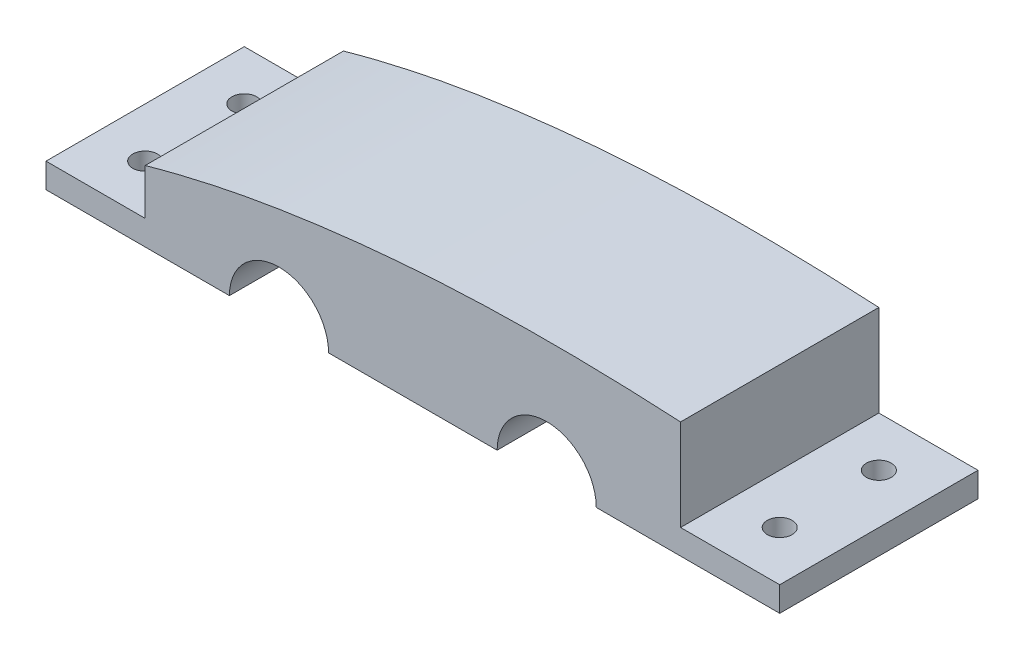
ISO-10303-21;
HEADER;
FILE_DESCRIPTION(('STEP AP214'),'2;1');
FILE_NAME('part.step','',(''),(''),'','','');
FILE_SCHEMA(('AUTOMOTIVE_DESIGN { 1 0 10303 214 1 1 1 1 }'));
ENDSEC;
DATA;
#1=APPLICATION_CONTEXT('core data for automotive mechanical design processes');
#2=APPLICATION_PROTOCOL_DEFINITION('international standard','automotive_design',2000,#1);
#3=PRODUCT_CONTEXT('',#1,'mechanical');
#4=PRODUCT('Part','Part','',(#3));
#5=PRODUCT_RELATED_PRODUCT_CATEGORY('part','',(#4));
#6=PRODUCT_DEFINITION_FORMATION('','',#4);
#7=PRODUCT_DEFINITION_CONTEXT('part definition',#1,'design');
#8=PRODUCT_DEFINITION('design','',#6,#7);
#9=PRODUCT_DEFINITION_SHAPE('','',#8);
#10=(LENGTH_UNIT() NAMED_UNIT(*) SI_UNIT(.MILLI.,.METRE.));
#11=(NAMED_UNIT(*) PLANE_ANGLE_UNIT() SI_UNIT($,.RADIAN.));
#12=(NAMED_UNIT(*) SI_UNIT($,.STERADIAN.) SOLID_ANGLE_UNIT());
#13=UNCERTAINTY_MEASURE_WITH_UNIT(LENGTH_MEASURE(1.E-05),#10,'distance_accuracy_value','');
#14=(GEOMETRIC_REPRESENTATION_CONTEXT(3) GLOBAL_UNCERTAINTY_ASSIGNED_CONTEXT((#13)) GLOBAL_UNIT_ASSIGNED_CONTEXT((#10,
#11,#12)) REPRESENTATION_CONTEXT('',''));
#15=CARTESIAN_POINT('',(0.,0.,0.));
#16=DIRECTION('',(0.,0.,1.));
#17=DIRECTION('',(1.,0.,0.));
#18=AXIS2_PLACEMENT_3D('',#15,#16,#17);
#19=CARTESIAN_POINT('',(171.449749333207,-10.5133996749356,-0.01));
#20=CARTESIAN_POINT('',(167.669323974137,-9.38687144257322,-0.01));
#21=CARTESIAN_POINT('',(160.126717088744,-7.13925145409268,-0.01));
#22=CARTESIAN_POINT('',(145.007574659483,-3.01904156990206,-0.01));
#23=CARTESIAN_POINT('',(126.087520845139,1.58608689730649,-0.01));
#24=CARTESIAN_POINT('',(103.308814692679,6.22402941138375,-0.01));
#25=CARTESIAN_POINT('',(80.5302542305183,10.1235861436547,-0.01));
#26=CARTESIAN_POINT('',(57.7160336117001,13.0616376425244,-0.01));
#27=CARTESIAN_POINT('',(34.8823437261635,15.0991545350443,-0.01));
#28=CARTESIAN_POINT('',(15.7911698545236,15.5692729828805,-0.01));
#29=CARTESIAN_POINT('',(0.522525144892088,14.8779876296715,-0.01));
#30=CARTESIAN_POINT('',(-10.9586608851714,13.7617455830081,-0.01));
#31=CARTESIAN_POINT('',(-22.4803057465122,11.9866767737392,-0.01));
#32=CARTESIAN_POINT('',(-32.0461457755705,9.74964394732173,-0.01));
#33=CARTESIAN_POINT('',(-39.7240058591971,7.44306576154118,-0.01));
#34=CARTESIAN_POINT('',(-45.5245586657192,5.23104505234823,-0.01));
#35=CARTESIAN_POINT('',(-50.4866830328745,2.80755642479047,-0.01));
#36=CARTESIAN_POINT('',(-54.8136805675138,-0.129701936584833,-0.01));
#37=CARTESIAN_POINT('',(-58.6337943880075,-4.92855886518599,-0.01));
#38=CARTESIAN_POINT('',(-54.7252887696433,-8.76141227245682,-0.01));
#39=CARTESIAN_POINT('',(-50.6811146110114,-10.325771279964,-0.01));
#40=CARTESIAN_POINT('',(-45.846738948145,-11.431808673902,-0.01));
#41=CARTESIAN_POINT('',(-40.1214795988188,-12.0720220030842,-0.01));
#42=CARTESIAN_POINT('',(-32.5028216601,-12.6101236186635,-0.01));
#43=CARTESIAN_POINT('',(-22.9740316769994,-12.8105276844888,-0.01));
#44=CARTESIAN_POINT('',(-11.5367123476593,-12.7631001336634,-0.01));
#45=CARTESIAN_POINT('',(-0.100565996580452,-12.4263225613083,-0.01));
#46=CARTESIAN_POINT('',(15.152639595194,-12.076873312515,-0.01));
#47=CARTESIAN_POINT('',(34.2164592156951,-11.6162769088298,-0.01));
#48=CARTESIAN_POINT('',(57.0954752798252,-11.3024167244446,-0.01));
#49=CARTESIAN_POINT('',(79.969407806855,-10.8935719975431,-0.01));
#50=CARTESIAN_POINT('',(102.842157731132,-10.6261384263908,-0.01));
#51=CARTESIAN_POINT('',(125.711620086274,-10.5735026616467,-0.01));
#52=CARTESIAN_POINT('',(144.765723839068,-10.7241641660872,-0.01));
#53=CARTESIAN_POINT('',(160.006871074314,-10.8875679238284,-0.01));
#54=CARTESIAN_POINT('',(167.626083605199,-11.0342639611544,-0.01));
#55=CARTESIAN_POINT('',(171.43558702053,-11.1076099995992,-0.01));
#56=B_SPLINE_CURVE_WITH_KNOTS('',3,(#19,#20,#21,#22,#23,#24,#25,#26,#27,#28,#29,#30,#31,#32,#33,
#34,#35,#36,#37,#38,#39,#40,#41,#42,#43,#44,#45,#46,#47,#48,#49,#50,#51,#52,#53,#54,#55),
.UNSPECIFIED.,.F.,.F.,(4,1,1,1,1,1,1,1,1,1,1,1,1,1,1,1,1,1,1,1,1,1,1,1,1,1,1,1,1,1,1,1,1,1,4),
(0.,0.0253048857109567,0.0504876533905406,0.100520432651506,0.150190715723339,0.199586606894546,
0.248740009224029,0.297715538989186,0.346600594361287,0.371102737044853,0.395726297170324,
0.420570145356384,0.445825119255769,0.458702215791061,0.471919981785349,0.485786002851729,
0.493461050828321,0.506863029175843,0.516147770049506,0.522766002591757,0.535269014058866,
0.54755113395783,0.559786370715184,0.584228898401235,0.608680810066395,0.633151283581104,
0.657621757095812,0.706558114036031,0.755481870433228,0.804405626830425,0.853320223819576,
0.902221408341012,0.951113135961066,0.975557227893806,1.),.UNSPECIFIED.);
#57=DIRECTION('',(0.,0.,1.));
#58=VECTOR('',#57,1.);
#59=SURFACE_OF_LINEAR_EXTRUSION('',#56,#58);
#60=CARTESIAN_POINT('',(171.449749333207,-10.5133996749356,25.4));
#61=CARTESIAN_POINT('',(167.669323974137,-9.38687144257322,25.4));
#62=CARTESIAN_POINT('',(160.126717088744,-7.13925145409268,25.4));
#63=CARTESIAN_POINT('',(145.007574659483,-3.01904156990206,25.4));
#64=CARTESIAN_POINT('',(126.087520845139,1.58608689730649,25.4));
#65=CARTESIAN_POINT('',(103.308814692679,6.22402941138375,25.4));
#66=CARTESIAN_POINT('',(80.5302542305183,10.1235861436547,25.4));
#67=CARTESIAN_POINT('',(57.7160336117001,13.0616376425244,25.4));
#68=CARTESIAN_POINT('',(34.8823437261635,15.0991545350443,25.4));
#69=CARTESIAN_POINT('',(15.7911698545236,15.5692729828805,25.4));
#70=CARTESIAN_POINT('',(0.522525144892088,14.8779876296715,25.4));
#71=CARTESIAN_POINT('',(-10.9586608851714,13.7617455830081,25.4));
#72=CARTESIAN_POINT('',(-22.4803057465122,11.9866767737392,25.4));
#73=CARTESIAN_POINT('',(-32.0461457755705,9.74964394732173,25.4));
#74=CARTESIAN_POINT('',(-39.7240058591971,7.44306576154118,25.4));
#75=CARTESIAN_POINT('',(-45.5245586657192,5.23104505234823,25.4));
#76=CARTESIAN_POINT('',(-50.4866830328745,2.80755642479047,25.4));
#77=CARTESIAN_POINT('',(-54.8136805675138,-0.129701936584833,25.4));
#78=CARTESIAN_POINT('',(-58.6337943880075,-4.92855886518599,25.4));
#79=CARTESIAN_POINT('',(-54.7252887696433,-8.76141227245682,25.4));
#80=CARTESIAN_POINT('',(-50.6811146110114,-10.325771279964,25.4));
#81=CARTESIAN_POINT('',(-45.846738948145,-11.431808673902,25.4));
#82=CARTESIAN_POINT('',(-40.1214795988188,-12.0720220030842,25.4));
#83=CARTESIAN_POINT('',(-32.5028216601,-12.6101236186635,25.4));
#84=CARTESIAN_POINT('',(-22.9740316769994,-12.8105276844888,25.4));
#85=CARTESIAN_POINT('',(-11.5367123476593,-12.7631001336634,25.4));
#86=CARTESIAN_POINT('',(-0.100565996580452,-12.4263225613083,25.4));
#87=CARTESIAN_POINT('',(15.152639595194,-12.076873312515,25.4));
#88=CARTESIAN_POINT('',(34.2164592156951,-11.6162769088298,25.4));
#89=CARTESIAN_POINT('',(57.0954752798252,-11.3024167244446,25.4));
#90=CARTESIAN_POINT('',(79.969407806855,-10.8935719975431,25.4));
#91=CARTESIAN_POINT('',(102.842157731132,-10.6261384263908,25.4));
#92=CARTESIAN_POINT('',(125.711620086274,-10.5735026616467,25.4));
#93=CARTESIAN_POINT('',(144.765723839068,-10.7241641660872,25.4));
#94=CARTESIAN_POINT('',(160.006871074314,-10.8875679238284,25.4));
#95=CARTESIAN_POINT('',(167.626083605199,-11.0342639611544,25.4));
#96=CARTESIAN_POINT('',(171.43558702053,-11.1076099995992,25.4));
#97=B_SPLINE_CURVE_WITH_KNOTS('',3,(#60,#61,#62,#63,#64,#65,#66,#67,#68,#69,#70,#71,#72,#73,#74,
#75,#76,#77,#78,#79,#80,#81,#82,#83,#84,#85,#86,#87,#88,#89,#90,#91,#92,#93,#94,#95,#96),
.UNSPECIFIED.,.F.,.F.,(4,1,1,1,1,1,1,1,1,1,1,1,1,1,1,1,1,1,1,1,1,1,1,1,1,1,1,1,1,1,1,1,1,1,4),
(0.,0.0253048857109567,0.0504876533905406,0.100520432651506,0.150190715723339,0.199586606894546,
0.248740009224029,0.297715538989186,0.346600594361287,0.371102737044853,0.395726297170324,
0.420570145356384,0.445825119255769,0.458702215791061,0.471919981785349,0.485786002851729,
0.493461050828321,0.506863029175843,0.516147770049506,0.522766002591757,0.535269014058866,
0.54755113395783,0.559786370715184,0.584228898401235,0.608680810066395,0.633151283581104,
0.657621757095812,0.706558114036031,0.755481870433228,0.804405626830425,0.853320223819576,
0.902221408341012,0.951113135961066,0.975557227893806,1.),.UNSPECIFIED.);
#98=CARTESIAN_POINT('',(-34.29,9.0400991928682,25.4));
#99=VERTEX_POINT('',#98);
#100=CARTESIAN_POINT('',(34.29,14.886313469361,25.4));
#101=VERTEX_POINT('',#100);
#102=EDGE_CURVE('E219',#99,#101,#97,.F.);
#103=ORIENTED_EDGE('',*,*,#102,.T.);
#104=DIRECTION('',(0.,0.,1.));
#105=VECTOR('',#104,1.);
#106=CARTESIAN_POINT('',(34.29,14.8863134683582,-0.01));
#107=LINE('',#106,#105);
#108=CARTESIAN_POINT('',(34.29,14.886313469361,0.));
#109=VERTEX_POINT('',#108);
#110=EDGE_CURVE('E210',#101,#109,#107,.F.);
#111=ORIENTED_EDGE('',*,*,#110,.T.);
#112=CARTESIAN_POINT('',(171.449749333207,-10.5133996749356,0.));
#113=CARTESIAN_POINT('',(167.669323974137,-9.38687144257322,0.));
#114=CARTESIAN_POINT('',(160.126717088744,-7.13925145409268,0.));
#115=CARTESIAN_POINT('',(145.007574659483,-3.01904156990206,0.));
#116=CARTESIAN_POINT('',(126.087520845139,1.58608689730649,0.));
#117=CARTESIAN_POINT('',(103.308814692679,6.22402941138375,0.));
#118=CARTESIAN_POINT('',(80.5302542305183,10.1235861436547,0.));
#119=CARTESIAN_POINT('',(57.7160336117001,13.0616376425244,0.));
#120=CARTESIAN_POINT('',(34.8823437261635,15.0991545350443,0.));
#121=CARTESIAN_POINT('',(15.7911698545236,15.5692729828805,0.));
#122=CARTESIAN_POINT('',(0.522525144892088,14.8779876296715,0.));
#123=CARTESIAN_POINT('',(-10.9586608851714,13.7617455830081,0.));
#124=CARTESIAN_POINT('',(-22.4803057465122,11.9866767737392,0.));
#125=CARTESIAN_POINT('',(-32.0461457755705,9.74964394732173,0.));
#126=CARTESIAN_POINT('',(-39.7240058591971,7.44306576154118,0.));
#127=CARTESIAN_POINT('',(-45.5245586657192,5.23104505234823,0.));
#128=CARTESIAN_POINT('',(-50.4866830328745,2.80755642479047,0.));
#129=CARTESIAN_POINT('',(-54.8136805675138,-0.129701936584833,0.));
#130=CARTESIAN_POINT('',(-58.6337943880075,-4.92855886518599,0.));
#131=CARTESIAN_POINT('',(-54.7252887696433,-8.76141227245682,0.));
#132=CARTESIAN_POINT('',(-50.6811146110114,-10.325771279964,0.));
#133=CARTESIAN_POINT('',(-45.846738948145,-11.431808673902,0.));
#134=CARTESIAN_POINT('',(-40.1214795988188,-12.0720220030842,0.));
#135=CARTESIAN_POINT('',(-32.5028216601,-12.6101236186635,0.));
#136=CARTESIAN_POINT('',(-22.9740316769994,-12.8105276844888,0.));
#137=CARTESIAN_POINT('',(-11.5367123476593,-12.7631001336634,0.));
#138=CARTESIAN_POINT('',(-0.100565996580452,-12.4263225613083,0.));
#139=CARTESIAN_POINT('',(15.152639595194,-12.076873312515,0.));
#140=CARTESIAN_POINT('',(34.2164592156951,-11.6162769088298,0.));
#141=CARTESIAN_POINT('',(57.0954752798252,-11.3024167244446,0.));
#142=CARTESIAN_POINT('',(79.969407806855,-10.8935719975431,0.));
#143=CARTESIAN_POINT('',(102.842157731132,-10.6261384263908,0.));
#144=CARTESIAN_POINT('',(125.711620086274,-10.5735026616467,0.));
#145=CARTESIAN_POINT('',(144.765723839068,-10.7241641660872,0.));
#146=CARTESIAN_POINT('',(160.006871074314,-10.8875679238284,0.));
#147=CARTESIAN_POINT('',(167.626083605199,-11.0342639611544,0.));
#148=CARTESIAN_POINT('',(171.43558702053,-11.1076099995992,0.));
#149=B_SPLINE_CURVE_WITH_KNOTS('',3,(#112,#113,#114,#115,#116,#117,#118,#119,#120,#121,#122,
#123,#124,#125,#126,#127,#128,#129,#130,#131,#132,#133,#134,#135,#136,#137,#138,#139,#140,#141,
#142,#143,#144,#145,#146,#147,#148),.UNSPECIFIED.,.F.,.F.,(4,1,1,1,1,1,1,1,1,1,1,1,1,1,1,1,1,1,
1,1,1,1,1,1,1,1,1,1,1,1,1,1,1,1,4),(0.,0.0253048857109567,0.0504876533905406,0.100520432651506,
0.150190715723339,0.199586606894546,0.248740009224029,0.297715538989186,0.346600594361287,
0.371102737044853,0.395726297170324,0.420570145356384,0.445825119255769,0.458702215791061,
0.471919981785349,0.485786002851729,0.493461050828321,0.506863029175843,0.516147770049506,
0.522766002591757,0.535269014058866,0.54755113395783,0.559786370715184,0.584228898401235,
0.608680810066395,0.633151283581104,0.657621757095812,0.706558114036031,0.755481870433228,
0.804405626830425,0.853320223819576,0.902221408341012,0.951113135961066,0.975557227893806,1.),.UNSPECIFIED.);
#150=CARTESIAN_POINT('',(-34.29,9.0400991928682,0.));
#151=VERTEX_POINT('',#150);
#152=EDGE_CURVE('E205',#151,#109,#149,.F.);
#153=ORIENTED_EDGE('',*,*,#152,.F.);
#154=DIRECTION('',(0.,0.,1.));
#155=VECTOR('',#154,1.);
#156=CARTESIAN_POINT('',(-34.29,9.0400991930606,-0.01));
#157=LINE('',#156,#155);
#158=EDGE_CURVE('E216',#151,#99,#157,.T.);
#159=ORIENTED_EDGE('',*,*,#158,.T.);
#160=EDGE_LOOP('',(#103,#111,#153,#159));
#161=FACE_BOUND('',#160,.T.);
#162=ADVANCED_FACE('F41',(#161),#59,.T.);
#163=CARTESIAN_POINT('',(40.64,0.,6.34999999999999));
#164=DIRECTION('',(0.,1.,0.));
#165=DIRECTION('',(-1.,0.,0.));
#166=AXIS2_PLACEMENT_3D('',#163,#164,#165);
#167=CYLINDRICAL_SURFACE('',#166,1.5875);
#168=CARTESIAN_POINT('',(40.64,0.,6.34999999999999));
#169=DIRECTION('',(0.,1.,0.));
#170=DIRECTION('',(-1.,0.,0.));
#171=AXIS2_PLACEMENT_3D('',#168,#169,#170);
#172=CIRCLE('',#171,1.5875);
#173=CARTESIAN_POINT('',(39.0525,0.,6.34999999999999));
#174=VERTEX_POINT('',#173);
#175=EDGE_CURVE('E166',#174,#174,#172,.T.);
#176=ORIENTED_EDGE('',*,*,#175,.F.);
#177=EDGE_LOOP('',(#176));
#178=FACE_BOUND('',#177,.T.);
#179=CARTESIAN_POINT('',(40.64,3.175,6.34999999999999));
#180=DIRECTION('',(0.,1.,0.));
#181=DIRECTION('',(-1.,0.,0.));
#182=AXIS2_PLACEMENT_3D('',#179,#180,#181);
#183=CIRCLE('',#182,1.5875);
#184=CARTESIAN_POINT('',(39.0525,3.175,6.34999999999999));
#185=VERTEX_POINT('',#184);
#186=EDGE_CURVE('E186',#185,#185,#183,.T.);
#187=ORIENTED_EDGE('',*,*,#186,.T.);
#188=EDGE_LOOP('',(#187));
#189=FACE_BOUND('',#188,.T.);
#190=ADVANCED_FACE('F313',(#178,#189),#167,.F.);
#191=CARTESIAN_POINT('',(40.64,0.,19.05));
#192=DIRECTION('',(0.,1.,0.));
#193=DIRECTION('',(-1.,0.,0.));
#194=AXIS2_PLACEMENT_3D('',#191,#192,#193);
#195=CYLINDRICAL_SURFACE('',#194,1.5875);
#196=CARTESIAN_POINT('',(40.64,0.,19.05));
#197=DIRECTION('',(0.,1.,0.));
#198=DIRECTION('',(1.,0.,0.));
#199=AXIS2_PLACEMENT_3D('',#196,#197,#198);
#200=CIRCLE('',#199,1.5875);
#201=CARTESIAN_POINT('',(42.2275,0.,19.05));
#202=VERTEX_POINT('',#201);
#203=EDGE_CURVE('E198',#202,#202,#200,.T.);
#204=ORIENTED_EDGE('',*,*,#203,.F.);
#205=EDGE_LOOP('',(#204));
#206=FACE_BOUND('',#205,.T.);
#207=CARTESIAN_POINT('',(40.64,3.175,19.05));
#208=DIRECTION('',(0.,1.,0.));
#209=DIRECTION('',(1.,0.,0.));
#210=AXIS2_PLACEMENT_3D('',#207,#208,#209);
#211=CIRCLE('',#210,1.5875);
#212=CARTESIAN_POINT('',(42.2275,3.175,19.05));
#213=VERTEX_POINT('',#212);
#214=EDGE_CURVE('E189',#213,#213,#211,.T.);
#215=ORIENTED_EDGE('',*,*,#214,.T.);
#216=EDGE_LOOP('',(#215));
#217=FACE_BOUND('',#216,.T.);
#218=ADVANCED_FACE('F315',(#206,#217),#195,.F.);
#219=CARTESIAN_POINT('',(-40.64,0.,19.05));
#220=DIRECTION('',(0.,1.,0.));
#221=DIRECTION('',(-1.,0.,0.));
#222=AXIS2_PLACEMENT_3D('',#219,#220,#221);
#223=CYLINDRICAL_SURFACE('',#222,1.58750000000001);
#224=CARTESIAN_POINT('',(-40.64,0.,19.05));
#225=DIRECTION('',(0.,1.,0.));
#226=DIRECTION('',(-1.,0.,0.));
#227=AXIS2_PLACEMENT_3D('',#224,#225,#226);
#228=CIRCLE('',#227,1.58750000000001);
#229=CARTESIAN_POINT('',(-42.2275,0.,19.05));
#230=VERTEX_POINT('',#229);
#231=EDGE_CURVE('E11',#230,#230,#228,.T.);
#232=ORIENTED_EDGE('',*,*,#231,.F.);
#233=EDGE_LOOP('',(#232));
#234=FACE_BOUND('',#233,.T.);
#235=CARTESIAN_POINT('',(-40.64,3.17499999999992,19.05));
#236=DIRECTION('',(0.,1.,0.));
#237=DIRECTION('',(-1.,0.,0.));
#238=AXIS2_PLACEMENT_3D('',#235,#236,#237);
#239=CIRCLE('',#238,1.58750000000001);
#240=CARTESIAN_POINT('',(-42.2275,3.17499999999992,19.05));
#241=VERTEX_POINT('',#240);
#242=EDGE_CURVE('E53',#241,#241,#239,.T.);
#243=ORIENTED_EDGE('',*,*,#242,.T.);
#244=EDGE_LOOP('',(#243));
#245=FACE_BOUND('',#244,.T.);
#246=ADVANCED_FACE('F307',(#234,#245),#223,.F.);
#247=CARTESIAN_POINT('',(-40.64,0.,6.35));
#248=DIRECTION('',(0.,1.,0.));
#249=DIRECTION('',(-1.,0.,0.));
#250=AXIS2_PLACEMENT_3D('',#247,#248,#249);
#251=CYLINDRICAL_SURFACE('',#250,1.58750000000001);
#252=CARTESIAN_POINT('',(-40.64,0.,6.35));
#253=DIRECTION('',(0.,1.,0.));
#254=DIRECTION('',(1.,0.,0.));
#255=AXIS2_PLACEMENT_3D('',#252,#253,#254);
#256=CIRCLE('',#255,1.58750000000001);
#257=CARTESIAN_POINT('',(-39.0525,0.,6.35));
#258=VERTEX_POINT('',#257);
#259=EDGE_CURVE('E192',#258,#258,#256,.T.);
#260=ORIENTED_EDGE('',*,*,#259,.F.);
#261=EDGE_LOOP('',(#260));
#262=FACE_BOUND('',#261,.T.);
#263=CARTESIAN_POINT('',(-40.64,3.17499999999992,6.35));
#264=DIRECTION('',(0.,1.,0.));
#265=DIRECTION('',(1.,0.,0.));
#266=AXIS2_PLACEMENT_3D('',#263,#264,#265);
#267=CIRCLE('',#266,1.58750000000001);
#268=CARTESIAN_POINT('',(-39.0525,3.17499999999992,6.35));
#269=VERTEX_POINT('',#268);
#270=EDGE_CURVE('E195',#269,#269,#267,.T.);
#271=ORIENTED_EDGE('',*,*,#270,.T.);
#272=EDGE_LOOP('',(#271));
#273=FACE_BOUND('',#272,.T.);
#274=ADVANCED_FACE('F299',(#262,#273),#251,.F.);
#275=CARTESIAN_POINT('',(-46.99,3.17499999999999,25.4));
#276=DIRECTION('',(0.,-1.,0.));
#277=DIRECTION('',(1.,0.,0.));
#278=AXIS2_PLACEMENT_3D('',#275,#276,#277);
#279=PLANE('',#278);
#280=ORIENTED_EDGE('',*,*,#270,.F.);
#281=EDGE_LOOP('',(#280));
#282=FACE_BOUND('',#281,.T.);
#283=ORIENTED_EDGE('',*,*,#242,.F.);
#284=EDGE_LOOP('',(#283));
#285=FACE_BOUND('',#284,.T.);
#286=DIRECTION('',(-1.,0.,0.));
#287=VECTOR('',#286,1.);
#288=CARTESIAN_POINT('',(-46.99,3.17499999999999,0.));
#289=LINE('',#288,#287);
#290=CARTESIAN_POINT('',(-34.29,3.17499999999999,0.));
#291=VERTEX_POINT('',#290);
#292=CARTESIAN_POINT('',(-46.99,3.17499999999999,0.));
#293=VERTEX_POINT('',#292);
#294=EDGE_CURVE('E159',#291,#293,#289,.T.);
#295=ORIENTED_EDGE('',*,*,#294,.T.);
#296=DIRECTION('',(0.,0.,-1.));
#297=VECTOR('',#296,1.);
#298=CARTESIAN_POINT('',(-46.99,3.17499999999999,25.4));
#299=LINE('',#298,#297);
#300=CARTESIAN_POINT('',(-46.99,3.17499999999999,25.4));
#301=VERTEX_POINT('',#300);
#302=EDGE_CURVE('E257',#301,#293,#299,.T.);
#303=ORIENTED_EDGE('',*,*,#302,.F.);
#304=DIRECTION('',(-1.,0.,0.));
#305=VECTOR('',#304,1.);
#306=CARTESIAN_POINT('',(-46.99,3.17499999999999,25.4));
#307=LINE('',#306,#305);
#308=CARTESIAN_POINT('',(-34.29,3.17499999999999,25.4));
#309=VERTEX_POINT('',#308);
#310=EDGE_CURVE('E176',#309,#301,#307,.T.);
#311=ORIENTED_EDGE('',*,*,#310,.F.);
#312=DIRECTION('',(0.,0.,-1.));
#313=VECTOR('',#312,1.);
#314=CARTESIAN_POINT('',(-34.29,3.17499999999999,25.4));
#315=LINE('',#314,#313);
#316=EDGE_CURVE('E259',#309,#291,#315,.T.);
#317=ORIENTED_EDGE('',*,*,#316,.T.);
#318=EDGE_LOOP('',(#295,#303,#311,#317));
#319=FACE_BOUND('',#318,.T.);
#320=ADVANCED_FACE('F297',(#282,#285,#319),#279,.F.);
#321=CARTESIAN_POINT('',(-46.99,0.,25.4));
#322=DIRECTION('',(1.,0.,0.));
#323=DIRECTION('',(0.,1.,0.));
#324=AXIS2_PLACEMENT_3D('',#321,#322,#323);
#325=PLANE('',#324);
#326=DIRECTION('',(0.,-1.,0.));
#327=VECTOR('',#326,1.);
#328=CARTESIAN_POINT('',(-46.99,0.,0.));
#329=LINE('',#328,#327);
#330=CARTESIAN_POINT('',(-46.99,0.,0.));
#331=VERTEX_POINT('',#330);
#332=EDGE_CURVE('E234',#293,#331,#329,.T.);
#333=ORIENTED_EDGE('',*,*,#332,.T.);
#334=DIRECTION('',(0.,0.,-1.));
#335=VECTOR('',#334,1.);
#336=CARTESIAN_POINT('',(-46.99,0.,25.4));
#337=LINE('',#336,#335);
#338=CARTESIAN_POINT('',(-46.99,0.,25.4));
#339=VERTEX_POINT('',#338);
#340=EDGE_CURVE('E255',#339,#331,#337,.T.);
#341=ORIENTED_EDGE('',*,*,#340,.F.);
#342=DIRECTION('',(0.,-1.,0.));
#343=VECTOR('',#342,1.);
#344=CARTESIAN_POINT('',(-46.99,0.,25.4));
#345=LINE('',#344,#343);
#346=EDGE_CURVE('E174',#301,#339,#345,.T.);
#347=ORIENTED_EDGE('',*,*,#346,.F.);
#348=ORIENTED_EDGE('',*,*,#302,.T.);
#349=EDGE_LOOP('',(#333,#341,#347,#348));
#350=FACE_BOUND('',#349,.T.);
#351=ADVANCED_FACE('F282',(#350),#325,.F.);
#352=CARTESIAN_POINT('',(-23.495,0.,25.4));
#353=DIRECTION('',(0.,1.,0.));
#354=DIRECTION('',(-1.,0.,0.));
#355=AXIS2_PLACEMENT_3D('',#352,#353,#354);
#356=PLANE('',#355);
#357=ORIENTED_EDGE('',*,*,#259,.T.);
#358=EDGE_LOOP('',(#357));
#359=FACE_BOUND('',#358,.T.);
#360=ORIENTED_EDGE('',*,*,#231,.T.);
#361=EDGE_LOOP('',(#360));
#362=FACE_BOUND('',#361,.T.);
#363=DIRECTION('',(1.,0.,0.));
#364=VECTOR('',#363,1.);
#365=CARTESIAN_POINT('',(-23.495,0.,0.));
#366=LINE('',#365,#364);
#367=CARTESIAN_POINT('',(-23.495,0.,0.));
#368=VERTEX_POINT('',#367);
#369=EDGE_CURVE('E239',#331,#368,#366,.T.);
#370=ORIENTED_EDGE('',*,*,#369,.T.);
#371=DIRECTION('',(0.,0.,-1.));
#372=VECTOR('',#371,1.);
#373=CARTESIAN_POINT('',(-23.495,0.,25.4));
#374=LINE('',#373,#372);
#375=CARTESIAN_POINT('',(-23.495,0.,25.4));
#376=VERTEX_POINT('',#375);
#377=EDGE_CURVE('E252',#376,#368,#374,.T.);
#378=ORIENTED_EDGE('',*,*,#377,.F.);
#379=DIRECTION('',(1.,0.,0.));
#380=VECTOR('',#379,1.);
#381=CARTESIAN_POINT('',(-23.495,0.,25.4));
#382=LINE('',#381,#380);
#383=EDGE_CURVE('E172',#339,#376,#382,.T.);
#384=ORIENTED_EDGE('',*,*,#383,.F.);
#385=ORIENTED_EDGE('',*,*,#340,.T.);
#386=EDGE_LOOP('',(#370,#378,#384,#385));
#387=FACE_BOUND('',#386,.T.);
#388=ADVANCED_FACE('F281',(#359,#362,#387),#356,.F.);
#389=CARTESIAN_POINT('',(-10.795,0.,25.4));
#390=DIRECTION('',(0.,1.,0.));
#391=DIRECTION('',(-1.,0.,0.));
#392=AXIS2_PLACEMENT_3D('',#389,#390,#391);
#393=PLANE('',#392);
#394=DIRECTION('',(1.,0.,0.));
#395=VECTOR('',#394,1.);
#396=CARTESIAN_POINT('',(-10.795,0.,0.));
#397=LINE('',#396,#395);
#398=CARTESIAN_POINT('',(-10.795,0.,0.));
#399=VERTEX_POINT('',#398);
#400=CARTESIAN_POINT('',(10.795,0.,0.));
#401=VERTEX_POINT('',#400);
#402=EDGE_CURVE('E108',#399,#401,#397,.T.);
#403=ORIENTED_EDGE('',*,*,#402,.T.);
#404=DIRECTION('',(0.,0.,-1.));
#405=VECTOR('',#404,1.);
#406=CARTESIAN_POINT('',(10.795,0.,25.4));
#407=LINE('',#406,#405);
#408=CARTESIAN_POINT('',(10.795,0.,25.4));
#409=VERTEX_POINT('',#408);
#410=EDGE_CURVE('E170',#409,#401,#407,.T.);
#411=ORIENTED_EDGE('',*,*,#410,.F.);
#412=DIRECTION('',(1.,0.,0.));
#413=VECTOR('',#412,1.);
#414=CARTESIAN_POINT('',(-10.795,0.,25.4));
#415=LINE('',#414,#413);
#416=CARTESIAN_POINT('',(-10.795,0.,25.4));
#417=VERTEX_POINT('',#416);
#418=EDGE_CURVE('E167',#417,#409,#415,.T.);
#419=ORIENTED_EDGE('',*,*,#418,.F.);
#420=DIRECTION('',(0.,0.,-1.));
#421=VECTOR('',#420,1.);
#422=CARTESIAN_POINT('',(-10.795,0.,25.4));
#423=LINE('',#422,#421);
#424=EDGE_CURVE('E250',#417,#399,#423,.T.);
#425=ORIENTED_EDGE('',*,*,#424,.T.);
#426=EDGE_LOOP('',(#403,#411,#419,#425));
#427=FACE_BOUND('',#426,.T.);
#428=ADVANCED_FACE('F276',(#427),#393,.F.);
#429=CARTESIAN_POINT('',(17.145,0.,25.4));
#430=DIRECTION('',(0.,0.,-1.));
#431=DIRECTION('',(-1.,0.,0.));
#432=AXIS2_PLACEMENT_3D('',#429,#430,#431);
#433=CYLINDRICAL_SURFACE('',#432,6.35);
#434=CARTESIAN_POINT('',(17.145,0.,0.));
#435=DIRECTION('',(0.,0.,-1.));
#436=DIRECTION('',(-1.,0.,0.));
#437=AXIS2_PLACEMENT_3D('',#434,#435,#436);
#438=CIRCLE('',#437,6.35);
#439=CARTESIAN_POINT('',(23.495,0.,0.));
#440=VERTEX_POINT('',#439);
#441=EDGE_CURVE('E163',#401,#440,#438,.T.);
#442=ORIENTED_EDGE('',*,*,#441,.T.);
#443=DIRECTION('',(0.,0.,-1.));
#444=VECTOR('',#443,1.);
#445=CARTESIAN_POINT('',(23.495,0.,25.4));
#446=LINE('',#445,#444);
#447=CARTESIAN_POINT('',(23.495,0.,25.4));
#448=VERTEX_POINT('',#447);
#449=EDGE_CURVE('E209',#448,#440,#446,.T.);
#450=ORIENTED_EDGE('',*,*,#449,.F.);
#451=CARTESIAN_POINT('',(17.145,0.,25.4));
#452=DIRECTION('',(0.,0.,-1.));
#453=DIRECTION('',(-1.,0.,0.));
#454=AXIS2_PLACEMENT_3D('',#451,#452,#453);
#455=CIRCLE('',#454,6.35);
#456=EDGE_CURVE('E184',#409,#448,#455,.T.);
#457=ORIENTED_EDGE('',*,*,#456,.F.);
#458=ORIENTED_EDGE('',*,*,#410,.T.);
#459=EDGE_LOOP('',(#442,#450,#457,#458));
#460=FACE_BOUND('',#459,.T.);
#461=ADVANCED_FACE('F267',(#460),#433,.F.);
#462=CARTESIAN_POINT('',(23.495,0.,25.4));
#463=DIRECTION('',(0.,1.,0.));
#464=DIRECTION('',(-1.,0.,0.));
#465=AXIS2_PLACEMENT_3D('',#462,#463,#464);
#466=PLANE('',#465);
#467=ORIENTED_EDGE('',*,*,#203,.T.);
#468=EDGE_LOOP('',(#467));
#469=FACE_BOUND('',#468,.T.);
#470=ORIENTED_EDGE('',*,*,#175,.T.);
#471=EDGE_LOOP('',(#470));
#472=FACE_BOUND('',#471,.T.);
#473=DIRECTION('',(1.,0.,0.));
#474=VECTOR('',#473,1.);
#475=CARTESIAN_POINT('',(23.495,0.,0.));
#476=LINE('',#475,#474);
#477=CARTESIAN_POINT('',(46.99,0.,0.));
#478=VERTEX_POINT('',#477);
#479=EDGE_CURVE('E62',#440,#478,#476,.T.);
#480=ORIENTED_EDGE('',*,*,#479,.T.);
#481=DIRECTION('',(0.,0.,-1.));
#482=VECTOR('',#481,1.);
#483=CARTESIAN_POINT('',(46.99,0.,25.4));
#484=LINE('',#483,#482);
#485=CARTESIAN_POINT('',(46.99,0.,25.4));
#486=VERTEX_POINT('',#485);
#487=EDGE_CURVE('E139',#486,#478,#484,.T.);
#488=ORIENTED_EDGE('',*,*,#487,.F.);
#489=DIRECTION('',(1.,0.,0.));
#490=VECTOR('',#489,1.);
#491=CARTESIAN_POINT('',(23.495,0.,25.4));
#492=LINE('',#491,#490);
#493=EDGE_CURVE('E97',#448,#486,#492,.T.);
#494=ORIENTED_EDGE('',*,*,#493,.F.);
#495=ORIENTED_EDGE('',*,*,#449,.T.);
#496=EDGE_LOOP('',(#480,#488,#494,#495));
#497=FACE_BOUND('',#496,.T.);
#498=ADVANCED_FACE('F264',(#469,#472,#497),#466,.F.);
#499=CARTESIAN_POINT('',(46.99,0.,25.4));
#500=DIRECTION('',(-1.,0.,0.));
#501=DIRECTION('',(0.,-1.,0.));
#502=AXIS2_PLACEMENT_3D('',#499,#500,#501);
#503=PLANE('',#502);
#504=DIRECTION('',(0.,1.,0.));
#505=VECTOR('',#504,1.);
#506=CARTESIAN_POINT('',(46.99,0.,0.));
#507=LINE('',#506,#505);
#508=CARTESIAN_POINT('',(46.99,3.17500000000001,0.));
#509=VERTEX_POINT('',#508);
#510=EDGE_CURVE('E133',#478,#509,#507,.T.);
#511=ORIENTED_EDGE('',*,*,#510,.T.);
#512=DIRECTION('',(0.,0.,-1.));
#513=VECTOR('',#512,1.);
#514=CARTESIAN_POINT('',(46.99,3.17500000000001,25.4));
#515=LINE('',#514,#513);
#516=CARTESIAN_POINT('',(46.99,3.17500000000001,25.4));
#517=VERTEX_POINT('',#516);
#518=EDGE_CURVE('E137',#517,#509,#515,.T.);
#519=ORIENTED_EDGE('',*,*,#518,.F.);
#520=DIRECTION('',(0.,1.,0.));
#521=VECTOR('',#520,1.);
#522=CARTESIAN_POINT('',(46.99,0.,25.4));
#523=LINE('',#522,#521);
#524=EDGE_CURVE('E180',#486,#517,#523,.T.);
#525=ORIENTED_EDGE('',*,*,#524,.F.);
#526=ORIENTED_EDGE('',*,*,#487,.T.);
#527=EDGE_LOOP('',(#511,#519,#525,#526));
#528=FACE_BOUND('',#527,.T.);
#529=ADVANCED_FACE('F135',(#528),#503,.F.);
#530=CARTESIAN_POINT('',(46.99,3.17500000000001,25.4));
#531=DIRECTION('',(0.,-1.,0.));
#532=DIRECTION('',(1.,0.,0.));
#533=AXIS2_PLACEMENT_3D('',#530,#531,#532);
#534=PLANE('',#533);
#535=ORIENTED_EDGE('',*,*,#214,.F.);
#536=EDGE_LOOP('',(#535));
#537=FACE_BOUND('',#536,.T.);
#538=ORIENTED_EDGE('',*,*,#186,.F.);
#539=EDGE_LOOP('',(#538));
#540=FACE_BOUND('',#539,.T.);
#541=DIRECTION('',(-1.,0.,0.));
#542=VECTOR('',#541,1.);
#543=CARTESIAN_POINT('',(46.99,3.17500000000001,0.));
#544=LINE('',#543,#542);
#545=CARTESIAN_POINT('',(34.29,3.17499999999999,0.));
#546=VERTEX_POINT('',#545);
#547=EDGE_CURVE('E141',#509,#546,#544,.T.);
#548=ORIENTED_EDGE('',*,*,#547,.T.);
#549=DIRECTION('',(0.,0.,-1.));
#550=VECTOR('',#549,1.);
#551=CARTESIAN_POINT('',(34.29,3.17499999999999,25.4));
#552=LINE('',#551,#550);
#553=CARTESIAN_POINT('',(34.29,3.17499999999999,25.4));
#554=VERTEX_POINT('',#553);
#555=EDGE_CURVE('E148',#554,#546,#552,.T.);
#556=ORIENTED_EDGE('',*,*,#555,.F.);
#557=DIRECTION('',(-1.,0.,0.));
#558=VECTOR('',#557,1.);
#559=CARTESIAN_POINT('',(46.99,3.17500000000001,25.4));
#560=LINE('',#559,#558);
#561=EDGE_CURVE('E147',#517,#554,#560,.T.);
#562=ORIENTED_EDGE('',*,*,#561,.F.);
#563=ORIENTED_EDGE('',*,*,#518,.T.);
#564=EDGE_LOOP('',(#548,#556,#562,#563));
#565=FACE_BOUND('',#564,.T.);
#566=ADVANCED_FACE('F144',(#537,#540,#565),#534,.F.);
#567=CARTESIAN_POINT('',(34.29,3.17499999999999,25.4));
#568=DIRECTION('',(-1.,0.,0.));
#569=DIRECTION('',(0.,-1.,0.));
#570=AXIS2_PLACEMENT_3D('',#567,#568,#569);
#571=PLANE('',#570);
#572=ORIENTED_EDGE('',*,*,#110,.F.);
#573=DIRECTION('',(0.,1.,0.));
#574=VECTOR('',#573,1.);
#575=CARTESIAN_POINT('',(34.29,3.17499999999999,25.4));
#576=LINE('',#575,#574);
#577=EDGE_CURVE('E181',#554,#101,#576,.T.);
#578=ORIENTED_EDGE('',*,*,#577,.F.);
#579=ORIENTED_EDGE('',*,*,#555,.T.);
#580=DIRECTION('',(0.,1.,0.));
#581=VECTOR('',#580,1.);
#582=CARTESIAN_POINT('',(34.29,3.17499999999999,0.));
#583=LINE('',#582,#581);
#584=EDGE_CURVE('E155',#546,#109,#583,.T.);
#585=ORIENTED_EDGE('',*,*,#584,.T.);
#586=EDGE_LOOP('',(#572,#578,#579,#585));
#587=FACE_BOUND('',#586,.T.);
#588=ADVANCED_FACE('F295',(#587),#571,.F.);
#589=CARTESIAN_POINT('',(-34.29,3.17499999999999,25.4));
#590=DIRECTION('',(1.,0.,0.));
#591=DIRECTION('',(0.,1.,0.));
#592=AXIS2_PLACEMENT_3D('',#589,#590,#591);
#593=PLANE('',#592);
#594=ORIENTED_EDGE('',*,*,#158,.F.);
#595=DIRECTION('',(0.,-1.,0.));
#596=VECTOR('',#595,1.);
#597=CARTESIAN_POINT('',(-34.29,3.17499999999999,0.));
#598=LINE('',#597,#596);
#599=EDGE_CURVE('E157',#151,#291,#598,.T.);
#600=ORIENTED_EDGE('',*,*,#599,.T.);
#601=ORIENTED_EDGE('',*,*,#316,.F.);
#602=DIRECTION('',(0.,-1.,0.));
#603=VECTOR('',#602,1.);
#604=CARTESIAN_POINT('',(-34.29,3.17499999999999,25.4));
#605=LINE('',#604,#603);
#606=EDGE_CURVE('E178',#99,#309,#605,.T.);
#607=ORIENTED_EDGE('',*,*,#606,.F.);
#608=EDGE_LOOP('',(#594,#600,#601,#607));
#609=FACE_BOUND('',#608,.T.);
#610=ADVANCED_FACE('F296',(#609),#593,.F.);
#611=CARTESIAN_POINT('',(17.145,0.,0.));
#612=DIRECTION('',(0.,0.,-1.));
#613=DIRECTION('',(-1.,0.,0.));
#614=AXIS2_PLACEMENT_3D('',#611,#612,#613);
#615=PLANE('',#614);
#616=ORIENTED_EDGE('',*,*,#599,.F.);
#617=ORIENTED_EDGE('',*,*,#152,.T.);
#618=ORIENTED_EDGE('',*,*,#584,.F.);
#619=ORIENTED_EDGE('',*,*,#547,.F.);
#620=ORIENTED_EDGE('',*,*,#510,.F.);
#621=ORIENTED_EDGE('',*,*,#479,.F.);
#622=ORIENTED_EDGE('',*,*,#441,.F.);
#623=ORIENTED_EDGE('',*,*,#402,.F.);
#624=CARTESIAN_POINT('',(-17.145,0.,0.));
#625=DIRECTION('',(0.,0.,-1.));
#626=DIRECTION('',(1.,0.,0.));
#627=AXIS2_PLACEMENT_3D('',#624,#625,#626);
#628=CIRCLE('',#627,6.35);
#629=EDGE_CURVE('E244',#368,#399,#628,.T.);
#630=ORIENTED_EDGE('',*,*,#629,.F.);
#631=ORIENTED_EDGE('',*,*,#369,.F.);
#632=ORIENTED_EDGE('',*,*,#332,.F.);
#633=ORIENTED_EDGE('',*,*,#294,.F.);
#634=EDGE_LOOP('',(#616,#617,#618,#619,#620,#621,#622,#623,#630,#631,#632,#633));
#635=FACE_BOUND('',#634,.T.);
#636=ADVANCED_FACE('F152',(#635),#615,.T.);
#637=CARTESIAN_POINT('',(17.145,0.,25.4));
#638=DIRECTION('',(0.,0.,-1.));
#639=DIRECTION('',(-1.,0.,0.));
#640=AXIS2_PLACEMENT_3D('',#637,#638,#639);
#641=PLANE('',#640);
#642=ORIENTED_EDGE('',*,*,#102,.F.);
#643=ORIENTED_EDGE('',*,*,#606,.T.);
#644=ORIENTED_EDGE('',*,*,#310,.T.);
#645=ORIENTED_EDGE('',*,*,#346,.T.);
#646=ORIENTED_EDGE('',*,*,#383,.T.);
#647=CARTESIAN_POINT('',(-17.145,0.,25.4));
#648=DIRECTION('',(0.,0.,-1.));
#649=DIRECTION('',(1.,0.,0.));
#650=AXIS2_PLACEMENT_3D('',#647,#648,#649);
#651=CIRCLE('',#650,6.35);
#652=EDGE_CURVE('E169',#376,#417,#651,.T.);
#653=ORIENTED_EDGE('',*,*,#652,.T.);
#654=ORIENTED_EDGE('',*,*,#418,.T.);
#655=ORIENTED_EDGE('',*,*,#456,.T.);
#656=ORIENTED_EDGE('',*,*,#493,.T.);
#657=ORIENTED_EDGE('',*,*,#524,.T.);
#658=ORIENTED_EDGE('',*,*,#561,.T.);
#659=ORIENTED_EDGE('',*,*,#577,.T.);
#660=EDGE_LOOP('',(#642,#643,#644,#645,#646,#653,#654,#655,#656,#657,#658,#659));
#661=FACE_BOUND('',#660,.T.);
#662=ADVANCED_FACE('F43',(#661),#641,.F.);
#663=CARTESIAN_POINT('',(-17.145,0.,25.4));
#664=DIRECTION('',(0.,0.,-1.));
#665=DIRECTION('',(-1.,0.,0.));
#666=AXIS2_PLACEMENT_3D('',#663,#664,#665);
#667=CYLINDRICAL_SURFACE('',#666,6.35);
#668=ORIENTED_EDGE('',*,*,#629,.T.);
#669=ORIENTED_EDGE('',*,*,#424,.F.);
#670=ORIENTED_EDGE('',*,*,#652,.F.);
#671=ORIENTED_EDGE('',*,*,#377,.T.);
#672=EDGE_LOOP('',(#668,#669,#670,#671));
#673=FACE_BOUND('',#672,.T.);
#674=ADVANCED_FACE('F272',(#673),#667,.F.);
#675=CLOSED_SHELL('',(#162,#190,#218,#246,#274,#320,#351,#388,#428,#461,#498,#529,#566,#588,
#610,#636,#662,#674));
#676=MANIFOLD_SOLID_BREP('B2',#675);
#677=ADVANCED_BREP_SHAPE_REPRESENTATION('',(#18,#676),#14);
#678=SHAPE_DEFINITION_REPRESENTATION(#9,#677);
ENDSEC;
END-ISO-10303-21;
